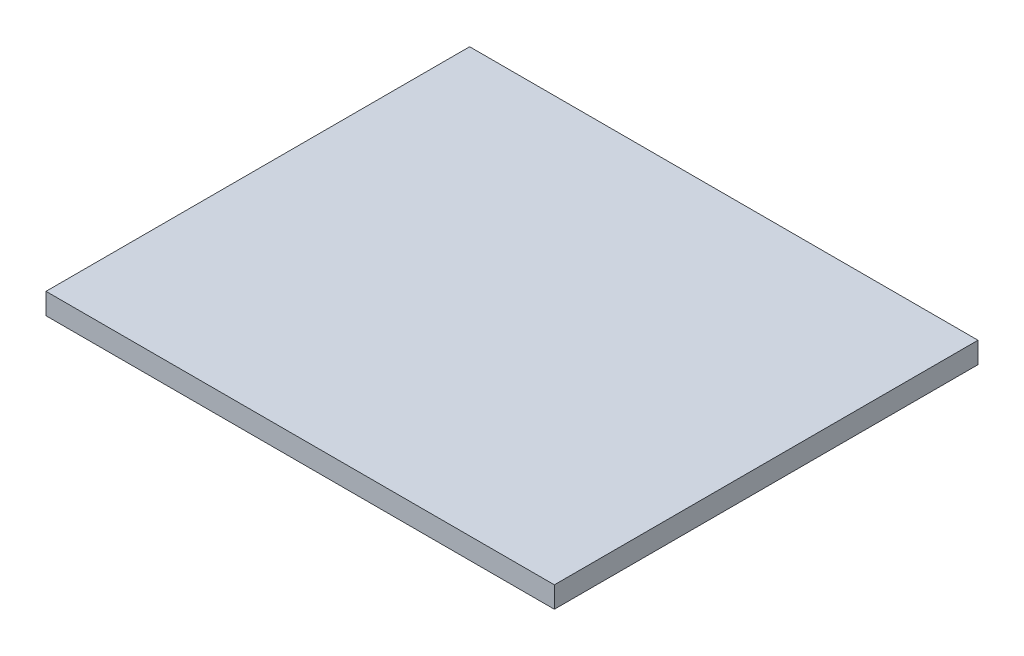
ISO-10303-21;
HEADER;
FILE_DESCRIPTION(('STEP AP214'),'2;1');
FILE_NAME('part.step','',(''),(''),'','','');
FILE_SCHEMA(('AUTOMOTIVE_DESIGN { 1 0 10303 214 1 1 1 1 }'));
ENDSEC;
DATA;
#1=APPLICATION_CONTEXT('core data for automotive mechanical design processes');
#2=APPLICATION_PROTOCOL_DEFINITION('international standard','automotive_design',2000,#1);
#3=PRODUCT_CONTEXT('',#1,'mechanical');
#4=PRODUCT('Part','Part','',(#3));
#5=PRODUCT_RELATED_PRODUCT_CATEGORY('part','',(#4));
#6=PRODUCT_DEFINITION_FORMATION('','',#4);
#7=PRODUCT_DEFINITION_CONTEXT('part definition',#1,'design');
#8=PRODUCT_DEFINITION('design','',#6,#7);
#9=PRODUCT_DEFINITION_SHAPE('','',#8);
#10=(LENGTH_UNIT() NAMED_UNIT(*) SI_UNIT(.MILLI.,.METRE.));
#11=(NAMED_UNIT(*) PLANE_ANGLE_UNIT() SI_UNIT($,.RADIAN.));
#12=(NAMED_UNIT(*) SI_UNIT($,.STERADIAN.) SOLID_ANGLE_UNIT());
#13=UNCERTAINTY_MEASURE_WITH_UNIT(LENGTH_MEASURE(1.E-05),#10,'distance_accuracy_value','');
#14=(GEOMETRIC_REPRESENTATION_CONTEXT(3) GLOBAL_UNCERTAINTY_ASSIGNED_CONTEXT((#13)) GLOBAL_UNIT_ASSIGNED_CONTEXT((#10,
#11,#12)) REPRESENTATION_CONTEXT('',''));
#15=CARTESIAN_POINT('',(0.,0.,0.));
#16=DIRECTION('',(0.,0.,1.));
#17=DIRECTION('',(1.,0.,0.));
#18=AXIS2_PLACEMENT_3D('',#15,#16,#17);
#19=CARTESIAN_POINT('',(-152.4,12.7,-127.));
#20=DIRECTION('',(1.,0.,0.));
#21=DIRECTION('',(0.,0.,-1.));
#22=AXIS2_PLACEMENT_3D('',#19,#20,#21);
#23=PLANE('',#22);
#24=DIRECTION('',(0.,0.,1.));
#25=VECTOR('',#24,1.);
#26=CARTESIAN_POINT('',(-152.4,0.,-127.));
#27=LINE('',#26,#25);
#28=CARTESIAN_POINT('',(-152.4,0.,-127.));
#29=VERTEX_POINT('',#28);
#30=CARTESIAN_POINT('',(-152.4,0.,127.));
#31=VERTEX_POINT('',#30);
#32=EDGE_CURVE('E97',#29,#31,#27,.T.);
#33=ORIENTED_EDGE('',*,*,#32,.T.);
#34=DIRECTION('',(0.,-1.,0.));
#35=VECTOR('',#34,1.);
#36=CARTESIAN_POINT('',(-152.4,12.7,127.));
#37=LINE('',#36,#35);
#38=CARTESIAN_POINT('',(-152.4,12.7,127.));
#39=VERTEX_POINT('',#38);
#40=EDGE_CURVE('E11',#39,#31,#37,.T.);
#41=ORIENTED_EDGE('',*,*,#40,.F.);
#42=DIRECTION('',(0.,0.,1.));
#43=VECTOR('',#42,1.);
#44=CARTESIAN_POINT('',(-152.4,12.7,-127.));
#45=LINE('',#44,#43);
#46=CARTESIAN_POINT('',(-152.4,12.7,-127.));
#47=VERTEX_POINT('',#46);
#48=EDGE_CURVE('E85',#47,#39,#45,.T.);
#49=ORIENTED_EDGE('',*,*,#48,.F.);
#50=DIRECTION('',(0.,-1.,0.));
#51=VECTOR('',#50,1.);
#52=CARTESIAN_POINT('',(-152.4,12.7,-127.));
#53=LINE('',#52,#51);
#54=EDGE_CURVE('E93',#47,#29,#53,.T.);
#55=ORIENTED_EDGE('',*,*,#54,.T.);
#56=EDGE_LOOP('',(#33,#41,#49,#55));
#57=FACE_BOUND('',#56,.T.);
#58=ADVANCED_FACE('F34',(#57),#23,.F.);
#59=CARTESIAN_POINT('',(-152.4,12.7,127.));
#60=DIRECTION('',(0.,0.,-1.));
#61=DIRECTION('',(-1.,0.,0.));
#62=AXIS2_PLACEMENT_3D('',#59,#60,#61);
#63=PLANE('',#62);
#64=DIRECTION('',(1.,0.,0.));
#65=VECTOR('',#64,1.);
#66=CARTESIAN_POINT('',(-152.4,0.,127.));
#67=LINE('',#66,#65);
#68=CARTESIAN_POINT('',(152.4,0.,127.));
#69=VERTEX_POINT('',#68);
#70=EDGE_CURVE('E89',#31,#69,#67,.T.);
#71=ORIENTED_EDGE('',*,*,#70,.T.);
#72=DIRECTION('',(0.,-1.,0.));
#73=VECTOR('',#72,1.);
#74=CARTESIAN_POINT('',(152.4,12.7,127.));
#75=LINE('',#74,#73);
#76=CARTESIAN_POINT('',(152.4,12.7,127.));
#77=VERTEX_POINT('',#76);
#78=EDGE_CURVE('E42',#77,#69,#75,.T.);
#79=ORIENTED_EDGE('',*,*,#78,.F.);
#80=DIRECTION('',(1.,0.,0.));
#81=VECTOR('',#80,1.);
#82=CARTESIAN_POINT('',(-152.4,12.7,127.));
#83=LINE('',#82,#81);
#84=EDGE_CURVE('E80',#39,#77,#83,.T.);
#85=ORIENTED_EDGE('',*,*,#84,.F.);
#86=ORIENTED_EDGE('',*,*,#40,.T.);
#87=EDGE_LOOP('',(#71,#79,#85,#86));
#88=FACE_BOUND('',#87,.T.);
#89=ADVANCED_FACE('F88',(#88),#63,.F.);
#90=CARTESIAN_POINT('',(152.4,12.7,-127.));
#91=DIRECTION('',(-1.,0.,0.));
#92=DIRECTION('',(0.,0.,1.));
#93=AXIS2_PLACEMENT_3D('',#90,#91,#92);
#94=PLANE('',#93);
#95=DIRECTION('',(0.,0.,-1.));
#96=VECTOR('',#95,1.);
#97=CARTESIAN_POINT('',(152.4,0.,-127.));
#98=LINE('',#97,#96);
#99=CARTESIAN_POINT('',(152.4,0.,-127.));
#100=VERTEX_POINT('',#99);
#101=EDGE_CURVE('E67',#69,#100,#98,.T.);
#102=ORIENTED_EDGE('',*,*,#101,.T.);
#103=DIRECTION('',(0.,-1.,0.));
#104=VECTOR('',#103,1.);
#105=CARTESIAN_POINT('',(152.4,12.7,-127.));
#106=LINE('',#105,#104);
#107=CARTESIAN_POINT('',(152.4,12.7,-127.));
#108=VERTEX_POINT('',#107);
#109=EDGE_CURVE('E90',#108,#100,#106,.T.);
#110=ORIENTED_EDGE('',*,*,#109,.F.);
#111=DIRECTION('',(0.,0.,-1.));
#112=VECTOR('',#111,1.);
#113=CARTESIAN_POINT('',(152.4,12.7,-127.));
#114=LINE('',#113,#112);
#115=EDGE_CURVE('E83',#77,#108,#114,.T.);
#116=ORIENTED_EDGE('',*,*,#115,.F.);
#117=ORIENTED_EDGE('',*,*,#78,.T.);
#118=EDGE_LOOP('',(#102,#110,#116,#117));
#119=FACE_BOUND('',#118,.T.);
#120=ADVANCED_FACE('F91',(#119),#94,.F.);
#121=CARTESIAN_POINT('',(-152.4,12.7,-127.));
#122=DIRECTION('',(0.,0.,1.));
#123=DIRECTION('',(1.,0.,0.));
#124=AXIS2_PLACEMENT_3D('',#121,#122,#123);
#125=PLANE('',#124);
#126=DIRECTION('',(-1.,0.,0.));
#127=VECTOR('',#126,1.);
#128=CARTESIAN_POINT('',(-152.4,0.,-127.));
#129=LINE('',#128,#127);
#130=EDGE_CURVE('E73',#100,#29,#129,.T.);
#131=ORIENTED_EDGE('',*,*,#130,.T.);
#132=ORIENTED_EDGE('',*,*,#54,.F.);
#133=DIRECTION('',(-1.,0.,0.));
#134=VECTOR('',#133,1.);
#135=CARTESIAN_POINT('',(-152.4,12.7,-127.));
#136=LINE('',#135,#134);
#137=EDGE_CURVE('E50',#108,#47,#136,.T.);
#138=ORIENTED_EDGE('',*,*,#137,.F.);
#139=ORIENTED_EDGE('',*,*,#109,.T.);
#140=EDGE_LOOP('',(#131,#132,#138,#139));
#141=FACE_BOUND('',#140,.T.);
#142=ADVANCED_FACE('F104',(#141),#125,.F.);
#143=CARTESIAN_POINT('',(0.,12.7,0.));
#144=DIRECTION('',(0.,1.,0.));
#145=DIRECTION('',(0.,0.,1.));
#146=AXIS2_PLACEMENT_3D('',#143,#144,#145);
#147=PLANE('',#146);
#148=ORIENTED_EDGE('',*,*,#48,.T.);
#149=ORIENTED_EDGE('',*,*,#84,.T.);
#150=ORIENTED_EDGE('',*,*,#115,.T.);
#151=ORIENTED_EDGE('',*,*,#137,.T.);
#152=EDGE_LOOP('',(#148,#149,#150,#151));
#153=FACE_BOUND('',#152,.T.);
#154=ADVANCED_FACE('F81',(#153),#147,.T.);
#155=CARTESIAN_POINT('',(0.,0.,0.));
#156=DIRECTION('',(0.,1.,0.));
#157=DIRECTION('',(0.,0.,1.));
#158=AXIS2_PLACEMENT_3D('',#155,#156,#157);
#159=PLANE('',#158);
#160=ORIENTED_EDGE('',*,*,#32,.F.);
#161=ORIENTED_EDGE('',*,*,#130,.F.);
#162=ORIENTED_EDGE('',*,*,#101,.F.);
#163=ORIENTED_EDGE('',*,*,#70,.F.);
#164=EDGE_LOOP('',(#160,#161,#162,#163));
#165=FACE_BOUND('',#164,.T.);
#166=ADVANCED_FACE('F107',(#165),#159,.F.);
#167=CLOSED_SHELL('',(#58,#89,#120,#142,#154,#166));
#168=MANIFOLD_SOLID_BREP('B2',#167);
#169=ADVANCED_BREP_SHAPE_REPRESENTATION('',(#18,#168),#14);
#170=SHAPE_DEFINITION_REPRESENTATION(#9,#169);
ENDSEC;
END-ISO-10303-21;
